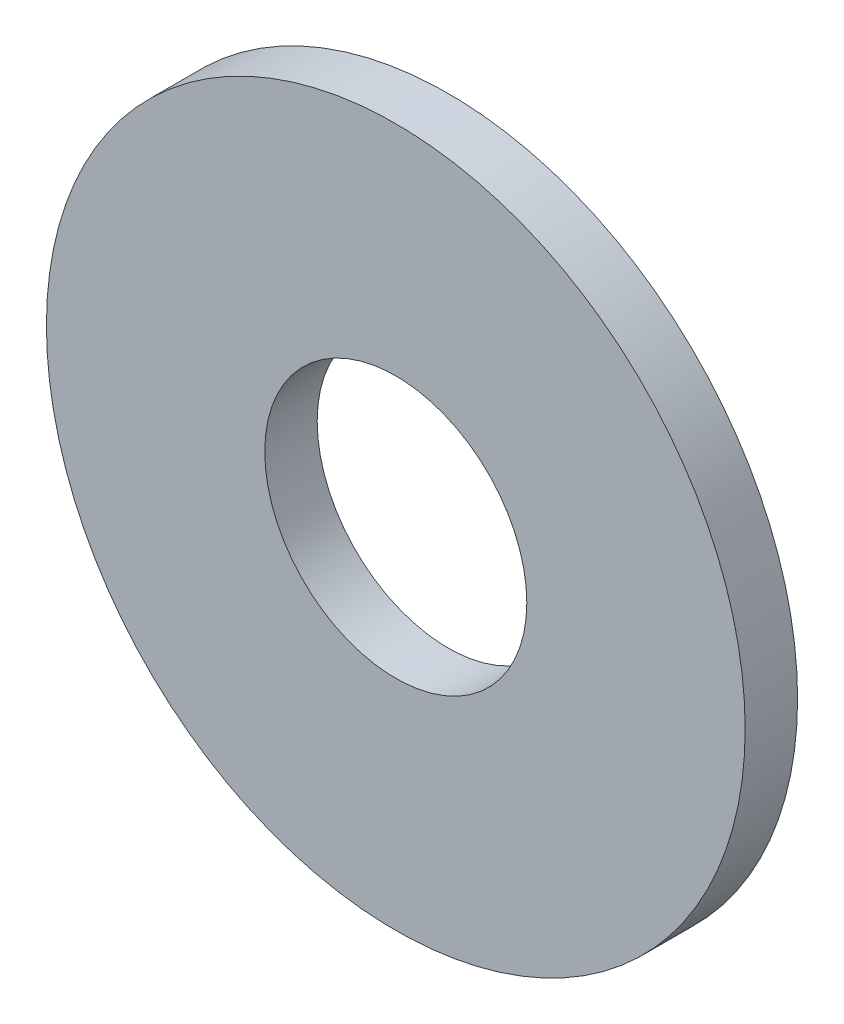
ISO-10303-21;
HEADER;
FILE_DESCRIPTION(('STEP AP214'),'2;1');
FILE_NAME('part.step','',(''),(''),'','','');
FILE_SCHEMA(('AUTOMOTIVE_DESIGN { 1 0 10303 214 1 1 1 1 }'));
ENDSEC;
DATA;
#1=APPLICATION_CONTEXT('core data for automotive mechanical design processes');
#2=APPLICATION_PROTOCOL_DEFINITION('international standard','automotive_design',2000,#1);
#3=PRODUCT_CONTEXT('',#1,'mechanical');
#4=PRODUCT('Part','Part','',(#3));
#5=PRODUCT_RELATED_PRODUCT_CATEGORY('part','',(#4));
#6=PRODUCT_DEFINITION_FORMATION('','',#4);
#7=PRODUCT_DEFINITION_CONTEXT('part definition',#1,'design');
#8=PRODUCT_DEFINITION('design','',#6,#7);
#9=PRODUCT_DEFINITION_SHAPE('','',#8);
#10=(LENGTH_UNIT() NAMED_UNIT(*) SI_UNIT(.MILLI.,.METRE.));
#11=(NAMED_UNIT(*) PLANE_ANGLE_UNIT() SI_UNIT($,.RADIAN.));
#12=(NAMED_UNIT(*) SI_UNIT($,.STERADIAN.) SOLID_ANGLE_UNIT());
#13=UNCERTAINTY_MEASURE_WITH_UNIT(LENGTH_MEASURE(1.E-05),#10,'distance_accuracy_value','');
#14=(GEOMETRIC_REPRESENTATION_CONTEXT(3) GLOBAL_UNCERTAINTY_ASSIGNED_CONTEXT((#13)) GLOBAL_UNIT_ASSIGNED_CONTEXT((#10,
#11,#12)) REPRESENTATION_CONTEXT('',''));
#15=CARTESIAN_POINT('',(0.,0.,0.));
#16=DIRECTION('',(0.,0.,1.));
#17=DIRECTION('',(1.,0.,0.));
#18=AXIS2_PLACEMENT_3D('',#15,#16,#17);
#19=CARTESIAN_POINT('',(0.,0.,6.));
#20=DIRECTION('',(0.,0.,1.));
#21=DIRECTION('',(1.,0.,0.));
#22=AXIS2_PLACEMENT_3D('',#19,#20,#21);
#23=PLANE('',#22);
#24=CARTESIAN_POINT('',(0.,0.,6.));
#25=DIRECTION('',(0.,0.,1.));
#26=DIRECTION('',(1.,0.,0.));
#27=AXIS2_PLACEMENT_3D('',#24,#25,#26);
#28=CIRCLE('',#27,40.);
#29=CARTESIAN_POINT('',(40.,0.,6.));
#30=VERTEX_POINT('',#29);
#31=EDGE_CURVE('E10',#30,#30,#28,.T.);
#32=ORIENTED_EDGE('',*,*,#31,.T.);
#33=EDGE_LOOP('',(#32));
#34=FACE_BOUND('',#33,.T.);
#35=CARTESIAN_POINT('',(0.,0.,6.));
#36=DIRECTION('',(0.,0.,1.));
#37=DIRECTION('',(1.,0.,0.));
#38=AXIS2_PLACEMENT_3D('',#35,#36,#37);
#39=CIRCLE('',#38,15.);
#40=CARTESIAN_POINT('',(15.,0.,6.));
#41=VERTEX_POINT('',#40);
#42=EDGE_CURVE('E42',#41,#41,#39,.T.);
#43=ORIENTED_EDGE('',*,*,#42,.F.);
#44=EDGE_LOOP('',(#43));
#45=FACE_BOUND('',#44,.T.);
#46=ADVANCED_FACE('F31',(#34,#45),#23,.T.);
#47=CARTESIAN_POINT('',(0.,0.,0.));
#48=DIRECTION('',(0.,0.,1.));
#49=DIRECTION('',(1.,0.,0.));
#50=AXIS2_PLACEMENT_3D('',#47,#48,#49);
#51=PLANE('',#50);
#52=CARTESIAN_POINT('',(0.,0.,0.));
#53=DIRECTION('',(0.,0.,1.));
#54=DIRECTION('',(1.,0.,0.));
#55=AXIS2_PLACEMENT_3D('',#52,#53,#54);
#56=CIRCLE('',#55,40.);
#57=CARTESIAN_POINT('',(40.,0.,0.));
#58=VERTEX_POINT('',#57);
#59=EDGE_CURVE('E35',#58,#58,#56,.T.);
#60=ORIENTED_EDGE('',*,*,#59,.F.);
#61=EDGE_LOOP('',(#60));
#62=FACE_BOUND('',#61,.T.);
#63=CARTESIAN_POINT('',(0.,0.,0.));
#64=DIRECTION('',(0.,0.,1.));
#65=DIRECTION('',(1.,0.,0.));
#66=AXIS2_PLACEMENT_3D('',#63,#64,#65);
#67=CIRCLE('',#66,15.);
#68=CARTESIAN_POINT('',(15.,0.,0.));
#69=VERTEX_POINT('',#68);
#70=EDGE_CURVE('E44',#69,#69,#67,.T.);
#71=ORIENTED_EDGE('',*,*,#70,.T.);
#72=EDGE_LOOP('',(#71));
#73=FACE_BOUND('',#72,.T.);
#74=ADVANCED_FACE('F54',(#62,#73),#51,.F.);
#75=CARTESIAN_POINT('',(0.,0.,6.));
#76=DIRECTION('',(0.,0.,-1.));
#77=DIRECTION('',(-1.,0.,0.));
#78=AXIS2_PLACEMENT_3D('',#75,#76,#77);
#79=CYLINDRICAL_SURFACE('',#78,40.);
#80=ORIENTED_EDGE('',*,*,#31,.F.);
#81=EDGE_LOOP('',(#80));
#82=FACE_BOUND('',#81,.T.);
#83=ORIENTED_EDGE('',*,*,#59,.T.);
#84=EDGE_LOOP('',(#83));
#85=FACE_BOUND('',#84,.T.);
#86=ADVANCED_FACE('F33',(#82,#85),#79,.T.);
#87=CARTESIAN_POINT('',(0.,0.,6.));
#88=DIRECTION('',(0.,0.,-1.));
#89=DIRECTION('',(-1.,0.,0.));
#90=AXIS2_PLACEMENT_3D('',#87,#88,#89);
#91=CYLINDRICAL_SURFACE('',#90,15.);
#92=ORIENTED_EDGE('',*,*,#42,.T.);
#93=EDGE_LOOP('',(#92));
#94=FACE_BOUND('',#93,.T.);
#95=ORIENTED_EDGE('',*,*,#70,.F.);
#96=EDGE_LOOP('',(#95));
#97=FACE_BOUND('',#96,.T.);
#98=ADVANCED_FACE('F50',(#94,#97),#91,.F.);
#99=CLOSED_SHELL('',(#46,#74,#86,#98));
#100=MANIFOLD_SOLID_BREP('B2',#99);
#101=ADVANCED_BREP_SHAPE_REPRESENTATION('',(#18,#100),#14);
#102=SHAPE_DEFINITION_REPRESENTATION(#9,#101);
ENDSEC;
END-ISO-10303-21;
